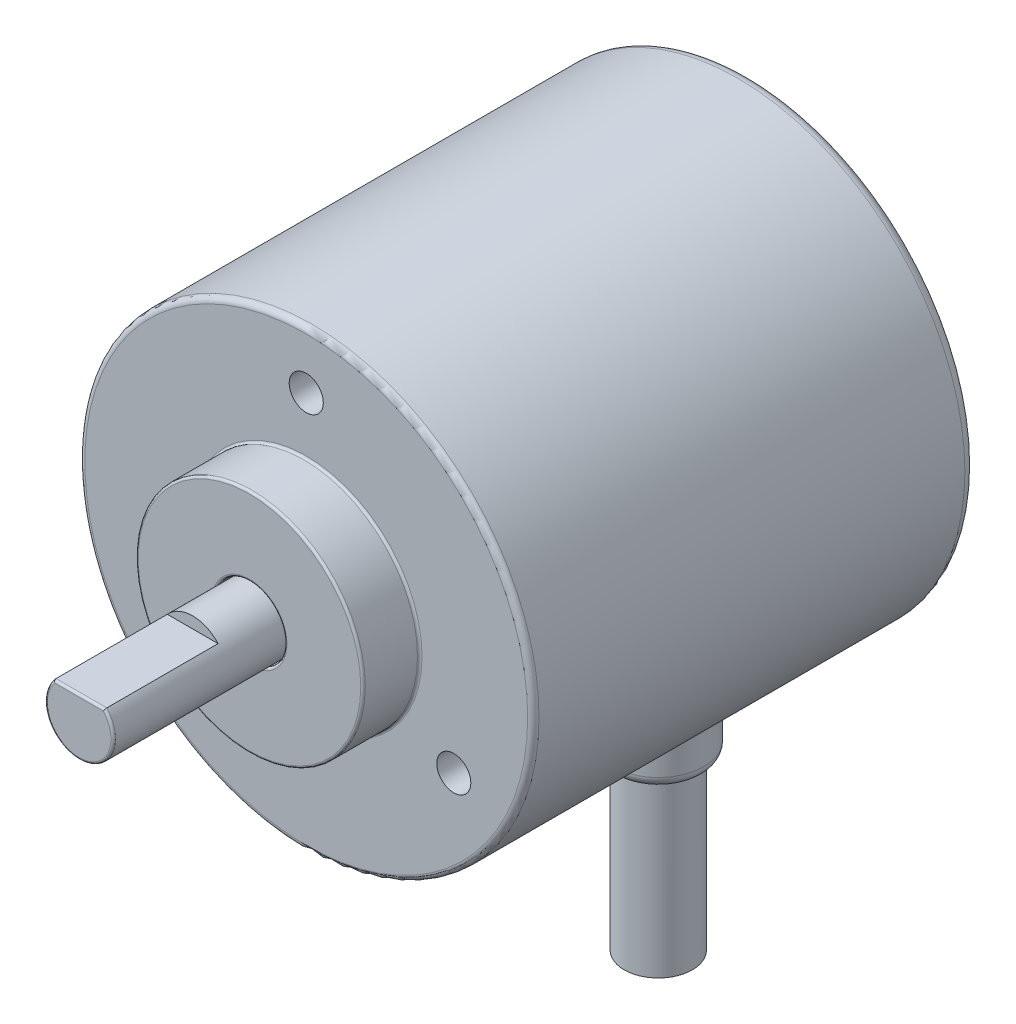
ISO-10303-21;
HEADER;
FILE_DESCRIPTION(('STEP AP214'),'2;1');
FILE_NAME('part.step','',(''),(''),'','','');
FILE_SCHEMA(('AUTOMOTIVE_DESIGN { 1 0 10303 214 1 1 1 1 }'));
ENDSEC;
DATA;
#1=APPLICATION_CONTEXT('core data for automotive mechanical design processes');
#2=APPLICATION_PROTOCOL_DEFINITION('international standard','automotive_design',2000,#1);
#3=PRODUCT_CONTEXT('',#1,'mechanical');
#4=PRODUCT('Part','Part','',(#3));
#5=PRODUCT_RELATED_PRODUCT_CATEGORY('part','',(#4));
#6=PRODUCT_DEFINITION_FORMATION('','',#4);
#7=PRODUCT_DEFINITION_CONTEXT('part definition',#1,'design');
#8=PRODUCT_DEFINITION('design','',#6,#7);
#9=PRODUCT_DEFINITION_SHAPE('','',#8);
#10=(LENGTH_UNIT() NAMED_UNIT(*) SI_UNIT(.MILLI.,.METRE.));
#11=(NAMED_UNIT(*) PLANE_ANGLE_UNIT() SI_UNIT($,.RADIAN.));
#12=(NAMED_UNIT(*) SI_UNIT($,.STERADIAN.) SOLID_ANGLE_UNIT());
#13=UNCERTAINTY_MEASURE_WITH_UNIT(LENGTH_MEASURE(1.E-05),#10,'distance_accuracy_value','');
#14=(GEOMETRIC_REPRESENTATION_CONTEXT(3) GLOBAL_UNCERTAINTY_ASSIGNED_CONTEXT((#13)) GLOBAL_UNIT_ASSIGNED_CONTEXT((#10,
#11,#12)) REPRESENTATION_CONTEXT('',''));
#15=CARTESIAN_POINT('',(0.,0.,0.));
#16=DIRECTION('',(0.,0.,1.));
#17=DIRECTION('',(1.,0.,0.));
#18=AXIS2_PLACEMENT_3D('',#15,#16,#17);
#19=CARTESIAN_POINT('',(0.,0.,39.));
#20=DIRECTION('',(0.,0.,-1.));
#21=DIRECTION('',(-1.,0.,0.));
#22=AXIS2_PLACEMENT_3D('',#19,#20,#21);
#23=CYLINDRICAL_SURFACE('',#22,20.);
#24=CARTESIAN_POINT('',(0.,0.,1.));
#25=DIRECTION('',(0.,0.,1.));
#26=DIRECTION('',(1.,0.,0.));
#27=AXIS2_PLACEMENT_3D('',#24,#25,#26);
#28=CIRCLE('',#27,20.);
#29=CARTESIAN_POINT('',(20.,0.,1.));
#30=VERTEX_POINT('',#29);
#31=EDGE_CURVE('E195',#30,#30,#28,.T.);
#32=ORIENTED_EDGE('',*,*,#31,.T.);
#33=EDGE_LOOP('',(#32));
#34=FACE_BOUND('',#33,.T.);
#35=CARTESIAN_POINT('',(0.,0.,38.5));
#36=DIRECTION('',(0.,0.,1.));
#37=DIRECTION('',(1.,0.,0.));
#38=AXIS2_PLACEMENT_3D('',#35,#36,#37);
#39=CIRCLE('',#38,20.);
#40=CARTESIAN_POINT('',(20.,0.,38.5));
#41=VERTEX_POINT('',#40);
#42=EDGE_CURVE('E199',#41,#41,#39,.F.);
#43=ORIENTED_EDGE('',*,*,#42,.T.);
#44=EDGE_LOOP('',(#43));
#45=FACE_BOUND('',#44,.T.);
#46=CARTESIAN_POINT('',(0.,-20.,12.));
#47=CARTESIAN_POINT('',(0.222307627170533,-19.9999959032348,11.9999918220066));
#48=CARTESIAN_POINT('',(0.444718640806089,-19.9962554071292,11.9814046281294));
#49=CARTESIAN_POINT('',(0.883254030756077,-19.9816946249293,11.907605999539));
#50=CARTESIAN_POINT('',(1.09937327016542,-19.9708687144076,11.852365468794));
#51=CARTESIAN_POINT('',(1.51892122105325,-19.9433459711314,11.7070349055168));
#52=CARTESIAN_POINT('',(1.72236187173253,-19.9266547630683,11.6169782526213));
#53=CARTESIAN_POINT('',(2.1112319554569,-19.889215921413,11.4046710099548));
#54=CARTESIAN_POINT('',(2.29666246030325,-19.8684685294298,11.2824223375711));
#55=CARTESIAN_POINT('',(2.64677390925945,-19.8248866131972,11.0074460228343));
#56=CARTESIAN_POINT('',(2.81117580463408,-19.8020298201681,10.8543665784353));
#57=CARTESIAN_POINT('',(3.11214702643213,-19.7569672181094,10.5228303344331));
#58=CARTESIAN_POINT('',(3.24871417908175,-19.7347614600387,10.3443715546591));
#59=CARTESIAN_POINT('',(3.49132701339042,-19.6932976724827,9.96513522795298));
#60=CARTESIAN_POINT('',(3.59708375546325,-19.6740682945156,9.76416942481637));
#61=CARTESIAN_POINT('',(3.77322266632145,-19.6410507224189,9.34687272398188));
#62=CARTESIAN_POINT('',(3.84360832974976,-19.6272619907853,9.13054334660788));
#63=CARTESIAN_POINT('',(3.94610119953993,-19.6069122097851,8.69166254436892));
#64=CARTESIAN_POINT('',(3.97869799183396,-19.6002588031638,8.4692298234434));
#65=CARTESIAN_POINT('',(4.00620851090316,-19.5946550013038,8.02196071455817));
#66=CARTESIAN_POINT('',(4.00112609085425,-19.5957038184152,7.79712457472649));
#67=CARTESIAN_POINT('',(3.9538182924077,-19.6053020462212,7.35501284791527));
#68=CARTESIAN_POINT('',(3.91215416097573,-19.6137381144293,7.13767437749055));
#69=CARTESIAN_POINT('',(3.79375153849209,-19.6369818463213,6.71313569334819));
#70=CARTESIAN_POINT('',(3.71701137240269,-19.65178981429,6.50593596432402));
#71=CARTESIAN_POINT('',(3.53009913469891,-19.6862247400376,6.10593895318555));
#72=CARTESIAN_POINT('',(3.41970460492847,-19.7058835925539,5.9132484817233));
#73=CARTESIAN_POINT('',(3.16877429829071,-19.7477847509168,5.54891660010876));
#74=CARTESIAN_POINT('',(3.02823505742731,-19.7700273535331,5.37727761259538));
#75=CARTESIAN_POINT('',(2.71799973824234,-19.81508084966,5.05668239017225));
#76=CARTESIAN_POINT('',(2.54782464484978,-19.8378947684366,4.90818972856348));
#77=CARTESIAN_POINT('',(2.18474009624804,-19.8811539485759,4.64178461479511));
#78=CARTESIAN_POINT('',(1.99183034951756,-19.9015991795588,4.52387255482569));
#79=CARTESIAN_POINT('',(1.58823754751568,-19.9378676064356,4.3218899630961));
#80=CARTESIAN_POINT('',(1.3775272783412,-19.9536835539309,4.23787242542185));
#81=CARTESIAN_POINT('',(0.944595905794659,-19.9788563595143,4.10655810384573));
#82=CARTESIAN_POINT('',(0.722376200289799,-19.9882140000212,4.05925687170549));
#83=CARTESIAN_POINT('',(0.276717622508603,-19.9993068746747,4.00337418482289));
#84=CARTESIAN_POINT('',(0.0533613133023055,-20.0011669860988,3.99415832183893));
#85=CARTESIAN_POINT('',(-0.391699736770856,-19.9974020772041,4.01299943576872));
#86=CARTESIAN_POINT('',(-0.613404569775172,-19.9917774776578,4.04105431741038));
#87=CARTESIAN_POINT('',(-1.04682263978616,-19.9737532803207,4.13311349417582));
#88=CARTESIAN_POINT('',(-1.25860779335961,-19.9614150561683,4.19679227399161));
#89=CARTESIAN_POINT('',(-1.66849450999867,-19.9313420824413,4.35793593062324));
#90=CARTESIAN_POINT('',(-1.86659504655016,-19.9136069285691,4.45540333870732));
#91=CARTESIAN_POINT('',(-2.24616469474487,-19.8743964613318,4.68272996260525));
#92=CARTESIAN_POINT('',(-2.42740050700875,-19.8528780174821,4.81297112415578));
#93=CARTESIAN_POINT('',(-2.76567207647683,-19.8085893931953,5.10163676482912));
#94=CARTESIAN_POINT('',(-2.92270523572305,-19.7858190787355,5.26006426559947));
#95=CARTESIAN_POINT('',(-3.2105623630967,-19.7411721422786,5.6034934075645));
#96=CARTESIAN_POINT('',(-3.34095080979462,-19.7193144093322,5.78886297688535));
#97=CARTESIAN_POINT('',(-3.56874168020482,-19.6793676718478,6.17924544542672));
#98=CARTESIAN_POINT('',(-3.66614542369161,-19.6612785165337,6.38425755829421));
#99=CARTESIAN_POINT('',(-3.82460736632784,-19.6310696233753,6.80707298459819));
#100=CARTESIAN_POINT('',(-3.8858539991642,-19.6189189948875,7.02480336484127));
#101=CARTESIAN_POINT('',(-3.97083460650878,-19.601897471681,7.46773381396362));
#102=CARTESIAN_POINT('',(-3.99457347290045,-19.5970256276445,7.69293290483739));
#103=CARTESIAN_POINT('',(-4.00368364346987,-19.5951659852552,8.14003545817727));
#104=CARTESIAN_POINT('',(-3.98974315228358,-19.598036767572,8.36192459570804));
#105=CARTESIAN_POINT('',(-3.92540921640024,-19.6110229393846,8.80012659962011));
#106=CARTESIAN_POINT('',(-3.87501606451719,-19.6211382706868,9.01643951077922));
#107=CARTESIAN_POINT('',(-3.73951427399582,-19.6474105687663,9.43691084496218));
#108=CARTESIAN_POINT('',(-3.65449002686938,-19.6635528407532,9.64109744200966));
#109=CARTESIAN_POINT('',(-3.45221857840642,-19.7000685989668,10.0324148829378));
#110=CARTESIAN_POINT('',(-3.33496867509953,-19.7204424399558,10.2195442949005));
#111=CARTESIAN_POINT('',(-3.06922365914566,-19.763558420929,10.5748622886013));
#112=CARTESIAN_POINT('',(-2.92023154894072,-19.786334916388,10.7426750610704));
#113=CARTESIAN_POINT('',(-2.59625747605256,-19.8314432748782,11.0511448221167));
#114=CARTESIAN_POINT('',(-2.42126954861334,-19.8537750345274,11.1917955612691));
#115=CARTESIAN_POINT('',(-2.04807051635299,-19.8957532955189,11.4433385757858));
#116=CARTESIAN_POINT('',(-1.84963553771934,-19.9153692487698,11.5539040131201));
#117=CARTESIAN_POINT('',(-1.43666544376293,-19.9494050034,11.7399444903864));
#118=CARTESIAN_POINT('',(-1.22214504345251,-19.9638294855446,11.81545115813));
#119=CARTESIAN_POINT('',(-0.839285955695119,-19.9830549038148,11.9146077921789));
#120=CARTESIAN_POINT('',(-0.67312665605514,-19.9893721263381,11.946572774831));
#121=CARTESIAN_POINT('',(-0.337998100840269,-19.9978461655957,11.9892716494335));
#122=CARTESIAN_POINT('',(-0.169028934994477,-20.0000031149262,12.0000062180391));
#123=CARTESIAN_POINT('',(0.,-20.,12.));
#124=B_SPLINE_CURVE_WITH_KNOTS('',3,(#46,#47,#48,#49,#50,#51,#52,#53,#54,#55,#56,#57,#58,#59,
#60,#61,#62,#63,#64,#65,#66,#67,#68,#69,#70,#71,#72,#73,#74,#75,#76,#77,#78,#79,#80,#81,#82,#83,
#84,#85,#86,#87,#88,#89,#90,#91,#92,#93,#94,#95,#96,#97,#98,#99,#100,#101,#102,#103,#104,#105,
#106,#107,#108,#109,#110,#111,#112,#113,#114,#115,#116,#117,#118,#119,#120,#121,#122,#123),
.UNSPECIFIED.,.T.,.F.,(4,2,2,2,2,2,2,2,2,2,2,2,2,2,2,2,2,2,2,2,2,2,2,2,2,2,2,2,2,2,2,2,2,2,2,2,
2,2,4),(0.,0.666304522645034,1.33313860276529,1.99933494100137,2.66549160892345,
3.33973068044874,4.01402238698946,4.6944478002369,5.3748059746079,6.04624740416218,
6.71762017128681,7.37886908028893,8.04014957018699,8.7058996081815,9.37172619002462,
10.0495300996918,10.7273427016306,11.4062109941988,12.0849970279592,12.7524294270884,
13.4198243063525,14.0812181580667,14.7426615686787,15.4122026413721,16.081815533875,
16.7616251432068,17.4414075489765,18.1176152413467,18.7937347332544,19.4575889027459,
20.1214377397421,20.7836784501622,21.4459747033125,22.1195230496035,22.793226181355,
23.4739798670633,24.1541182207385,24.6607510116336,25.1673676548776),.UNSPECIFIED.);
#125=CARTESIAN_POINT('',(0.,-20.,12.));
#126=VERTEX_POINT('',#125);
#127=EDGE_CURVE('E111',#126,#126,#124,.T.);
#128=ORIENTED_EDGE('',*,*,#127,.T.);
#129=EDGE_LOOP('',(#128));
#130=FACE_BOUND('',#129,.T.);
#131=ADVANCED_FACE('F51',(#34,#45,#130),#23,.T.);
#132=CARTESIAN_POINT('',(0.,0.,39.));
#133=DIRECTION('',(0.,0.,1.));
#134=DIRECTION('',(1.,0.,0.));
#135=AXIS2_PLACEMENT_3D('',#132,#133,#134);
#136=PLANE('',#135);
#137=CARTESIAN_POINT('',(0.,0.,39.));
#138=DIRECTION('',(0.,0.,1.));
#139=DIRECTION('',(1.,0.,0.));
#140=AXIS2_PLACEMENT_3D('',#137,#138,#139);
#141=CIRCLE('',#140,10.2);
#142=CARTESIAN_POINT('',(10.2,0.,39.));
#143=VERTEX_POINT('',#142);
#144=EDGE_CURVE('E255',#143,#143,#141,.F.);
#145=ORIENTED_EDGE('',*,*,#144,.T.);
#146=EDGE_LOOP('',(#145));
#147=FACE_BOUND('',#146,.T.);
#148=CARTESIAN_POINT('',(0.,0.,39.));
#149=DIRECTION('',(0.,0.,1.));
#150=DIRECTION('',(1.,0.,0.));
#151=AXIS2_PLACEMENT_3D('',#148,#149,#150);
#152=CIRCLE('',#151,19.5);
#153=CARTESIAN_POINT('',(19.5,0.,39.));
#154=VERTEX_POINT('',#153);
#155=EDGE_CURVE('E108',#154,#154,#152,.T.);
#156=ORIENTED_EDGE('',*,*,#155,.T.);
#157=EDGE_LOOP('',(#156));
#158=FACE_BOUND('',#157,.T.);
#159=CARTESIAN_POINT('',(0.,15.,39.));
#160=DIRECTION('',(0.,0.,1.));
#161=DIRECTION('',(1.,0.,0.));
#162=AXIS2_PLACEMENT_3D('',#159,#160,#161);
#163=CIRCLE('',#162,1.5);
#164=CARTESIAN_POINT('',(1.5,15.,39.));
#165=VERTEX_POINT('',#164);
#166=EDGE_CURVE('E280',#165,#165,#163,.T.);
#167=ORIENTED_EDGE('',*,*,#166,.F.);
#168=EDGE_LOOP('',(#167));
#169=FACE_BOUND('',#168,.T.);
#170=CARTESIAN_POINT('',(12.9903810567675,-7.49999999999945,39.));
#171=DIRECTION('',(0.,0.,1.));
#172=DIRECTION('',(1.,0.,0.));
#173=AXIS2_PLACEMENT_3D('',#170,#171,#172);
#174=CIRCLE('',#173,1.50000000000082);
#175=CARTESIAN_POINT('',(14.4903810567684,-7.49999999999945,39.));
#176=VERTEX_POINT('',#175);
#177=EDGE_CURVE('E286',#176,#176,#174,.T.);
#178=ORIENTED_EDGE('',*,*,#177,.F.);
#179=EDGE_LOOP('',(#178));
#180=FACE_BOUND('',#179,.T.);
#181=CARTESIAN_POINT('',(-12.9903810567656,-7.50000000000056,39.));
#182=DIRECTION('',(0.,0.,1.));
#183=DIRECTION('',(1.,0.,0.));
#184=AXIS2_PLACEMENT_3D('',#181,#182,#183);
#185=CIRCLE('',#184,1.50000000000122);
#186=CARTESIAN_POINT('',(-11.4903810567644,-7.50000000000056,39.));
#187=VERTEX_POINT('',#186);
#188=EDGE_CURVE('E119',#187,#187,#185,.T.);
#189=ORIENTED_EDGE('',*,*,#188,.F.);
#190=EDGE_LOOP('',(#189));
#191=FACE_BOUND('',#190,.T.);
#192=ADVANCED_FACE('F180',(#147,#158,#169,#180,#191),#136,.T.);
#193=CARTESIAN_POINT('',(0.,0.,0.));
#194=DIRECTION('',(0.,0.,1.));
#195=DIRECTION('',(1.,0.,0.));
#196=AXIS2_PLACEMENT_3D('',#193,#194,#195);
#197=PLANE('',#196);
#198=CARTESIAN_POINT('',(0.,0.,0.));
#199=DIRECTION('',(0.,0.,1.));
#200=DIRECTION('',(1.,0.,0.));
#201=AXIS2_PLACEMENT_3D('',#198,#199,#200);
#202=CIRCLE('',#201,19.);
#203=CARTESIAN_POINT('',(19.,0.,0.));
#204=VERTEX_POINT('',#203);
#205=EDGE_CURVE('E203',#204,#204,#202,.F.);
#206=ORIENTED_EDGE('',*,*,#205,.T.);
#207=EDGE_LOOP('',(#206));
#208=FACE_BOUND('',#207,.T.);
#209=ADVANCED_FACE('F178',(#208),#197,.F.);
#210=CARTESIAN_POINT('',(0.,0.,44.));
#211=DIRECTION('',(0.,0.,-1.));
#212=DIRECTION('',(-1.,0.,0.));
#213=AXIS2_PLACEMENT_3D('',#210,#211,#212);
#214=CYLINDRICAL_SURFACE('',#213,10.);
#215=CARTESIAN_POINT('',(0.,0.,39.2));
#216=DIRECTION('',(0.,0.,1.));
#217=DIRECTION('',(1.,0.,0.));
#218=AXIS2_PLACEMENT_3D('',#215,#216,#217);
#219=CIRCLE('',#218,10.);
#220=CARTESIAN_POINT('',(10.,0.,39.2));
#221=VERTEX_POINT('',#220);
#222=EDGE_CURVE('E226',#221,#221,#219,.T.);
#223=ORIENTED_EDGE('',*,*,#222,.T.);
#224=EDGE_LOOP('',(#223));
#225=FACE_BOUND('',#224,.T.);
#226=CARTESIAN_POINT('',(0.,0.,43.8));
#227=DIRECTION('',(0.,0.,1.));
#228=DIRECTION('',(1.,0.,0.));
#229=AXIS2_PLACEMENT_3D('',#226,#227,#228);
#230=CIRCLE('',#229,10.);
#231=CARTESIAN_POINT('',(10.,0.,43.8));
#232=VERTEX_POINT('',#231);
#233=EDGE_CURVE('E217',#232,#232,#230,.F.);
#234=ORIENTED_EDGE('',*,*,#233,.T.);
#235=EDGE_LOOP('',(#234));
#236=FACE_BOUND('',#235,.T.);
#237=ADVANCED_FACE('F174',(#225,#236),#214,.T.);
#238=CARTESIAN_POINT('',(0.,0.,44.));
#239=DIRECTION('',(0.,0.,1.));
#240=DIRECTION('',(1.,0.,0.));
#241=AXIS2_PLACEMENT_3D('',#238,#239,#240);
#242=PLANE('',#241);
#243=CARTESIAN_POINT('',(0.,0.,44.));
#244=DIRECTION('',(0.,0.,1.));
#245=DIRECTION('',(1.,0.,0.));
#246=AXIS2_PLACEMENT_3D('',#243,#244,#245);
#247=CIRCLE('',#246,3.3);
#248=CARTESIAN_POINT('',(3.3,0.,44.));
#249=VERTEX_POINT('',#248);
#250=EDGE_CURVE('E13',#249,#249,#247,.F.);
#251=ORIENTED_EDGE('',*,*,#250,.T.);
#252=EDGE_LOOP('',(#251));
#253=FACE_BOUND('',#252,.T.);
#254=CARTESIAN_POINT('',(0.,0.,44.));
#255=DIRECTION('',(0.,0.,1.));
#256=DIRECTION('',(1.,0.,0.));
#257=AXIS2_PLACEMENT_3D('',#254,#255,#256);
#258=CIRCLE('',#257,9.8);
#259=CARTESIAN_POINT('',(9.8,0.,44.));
#260=VERTEX_POINT('',#259);
#261=EDGE_CURVE('E214',#260,#260,#258,.T.);
#262=ORIENTED_EDGE('',*,*,#261,.T.);
#263=EDGE_LOOP('',(#262));
#264=FACE_BOUND('',#263,.T.);
#265=ADVANCED_FACE('F157',(#253,#264),#242,.T.);
#266=CARTESIAN_POINT('',(-12.9903810567656,-7.50000000000056,32.));
#267=DIRECTION('',(0.,0.,1.));
#268=DIRECTION('',(1.,0.,0.));
#269=AXIS2_PLACEMENT_3D('',#266,#267,#268);
#270=CYLINDRICAL_SURFACE('',#269,1.50000000000122);
#271=CARTESIAN_POINT('',(-12.9903810567656,-7.50000000000056,32.));
#272=DIRECTION('',(0.,0.,1.));
#273=DIRECTION('',(1.,0.,0.));
#274=AXIS2_PLACEMENT_3D('',#271,#272,#273);
#275=CIRCLE('',#274,1.50000000000122);
#276=CARTESIAN_POINT('',(-11.4903810567644,-7.50000000000056,32.));
#277=VERTEX_POINT('',#276);
#278=EDGE_CURVE('E289',#277,#277,#275,.T.);
#279=ORIENTED_EDGE('',*,*,#278,.F.);
#280=EDGE_LOOP('',(#279));
#281=FACE_BOUND('',#280,.T.);
#282=ORIENTED_EDGE('',*,*,#188,.T.);
#283=EDGE_LOOP('',(#282));
#284=FACE_BOUND('',#283,.T.);
#285=ADVANCED_FACE('F153',(#281,#284),#270,.F.);
#286=CARTESIAN_POINT('',(-12.9903810567656,-7.50000000000056,32.));
#287=DIRECTION('',(0.,0.,1.));
#288=DIRECTION('',(1.,0.,0.));
#289=AXIS2_PLACEMENT_3D('',#286,#287,#288);
#290=PLANE('',#289);
#291=ORIENTED_EDGE('',*,*,#278,.T.);
#292=EDGE_LOOP('',(#291));
#293=FACE_BOUND('',#292,.T.);
#294=ADVANCED_FACE('F149',(#293),#290,.T.);
#295=CARTESIAN_POINT('',(12.9903810567675,-7.49999999999945,32.));
#296=DIRECTION('',(0.,0.,1.));
#297=DIRECTION('',(1.,0.,0.));
#298=AXIS2_PLACEMENT_3D('',#295,#296,#297);
#299=CYLINDRICAL_SURFACE('',#298,1.50000000000082);
#300=CARTESIAN_POINT('',(12.9903810567675,-7.49999999999945,32.));
#301=DIRECTION('',(0.,0.,1.));
#302=DIRECTION('',(1.,0.,0.));
#303=AXIS2_PLACEMENT_3D('',#300,#301,#302);
#304=CIRCLE('',#303,1.50000000000082);
#305=CARTESIAN_POINT('',(14.4903810567684,-7.49999999999945,32.));
#306=VERTEX_POINT('',#305);
#307=EDGE_CURVE('E283',#306,#306,#304,.T.);
#308=ORIENTED_EDGE('',*,*,#307,.F.);
#309=EDGE_LOOP('',(#308));
#310=FACE_BOUND('',#309,.T.);
#311=ORIENTED_EDGE('',*,*,#177,.T.);
#312=EDGE_LOOP('',(#311));
#313=FACE_BOUND('',#312,.T.);
#314=ADVANCED_FACE('F145',(#310,#313),#299,.F.);
#315=CARTESIAN_POINT('',(12.9903810567675,-7.49999999999945,32.));
#316=DIRECTION('',(0.,0.,1.));
#317=DIRECTION('',(1.,0.,0.));
#318=AXIS2_PLACEMENT_3D('',#315,#316,#317);
#319=PLANE('',#318);
#320=ORIENTED_EDGE('',*,*,#307,.T.);
#321=EDGE_LOOP('',(#320));
#322=FACE_BOUND('',#321,.T.);
#323=ADVANCED_FACE('F141',(#322),#319,.T.);
#324=CARTESIAN_POINT('',(0.,15.,32.));
#325=DIRECTION('',(0.,0.,1.));
#326=DIRECTION('',(1.,0.,0.));
#327=AXIS2_PLACEMENT_3D('',#324,#325,#326);
#328=CYLINDRICAL_SURFACE('',#327,1.5);
#329=CARTESIAN_POINT('',(0.,15.,32.));
#330=DIRECTION('',(0.,0.,1.));
#331=DIRECTION('',(1.,0.,0.));
#332=AXIS2_PLACEMENT_3D('',#329,#330,#331);
#333=CIRCLE('',#332,1.5);
#334=CARTESIAN_POINT('',(1.5,15.,32.));
#335=VERTEX_POINT('',#334);
#336=EDGE_CURVE('E94',#335,#335,#333,.T.);
#337=ORIENTED_EDGE('',*,*,#336,.F.);
#338=EDGE_LOOP('',(#337));
#339=FACE_BOUND('',#338,.T.);
#340=ORIENTED_EDGE('',*,*,#166,.T.);
#341=EDGE_LOOP('',(#340));
#342=FACE_BOUND('',#341,.T.);
#343=ADVANCED_FACE('F137',(#339,#342),#328,.F.);
#344=CARTESIAN_POINT('',(0.,15.,32.));
#345=DIRECTION('',(0.,0.,1.));
#346=DIRECTION('',(1.,0.,0.));
#347=AXIS2_PLACEMENT_3D('',#344,#345,#346);
#348=PLANE('',#347);
#349=ORIENTED_EDGE('',*,*,#336,.T.);
#350=EDGE_LOOP('',(#349));
#351=FACE_BOUND('',#350,.T.);
#352=ADVANCED_FACE('F131',(#351),#348,.T.);
#353=CARTESIAN_POINT('',(0.,-28.,8.));
#354=DIRECTION('',(0.,1.,0.));
#355=DIRECTION('',(0.,0.,1.));
#356=AXIS2_PLACEMENT_3D('',#353,#354,#355);
#357=CYLINDRICAL_SURFACE('',#356,4.);
#358=CARTESIAN_POINT('',(0.,-27.,8.));
#359=DIRECTION('',(0.,1.,0.));
#360=DIRECTION('',(0.,0.,1.));
#361=AXIS2_PLACEMENT_3D('',#358,#359,#360);
#362=CIRCLE('',#361,4.);
#363=CARTESIAN_POINT('',(0.,-27.,12.));
#364=VERTEX_POINT('',#363);
#365=EDGE_CURVE('E208',#364,#364,#362,.T.);
#366=ORIENTED_EDGE('',*,*,#365,.T.);
#367=EDGE_LOOP('',(#366));
#368=FACE_BOUND('',#367,.T.);
#369=ORIENTED_EDGE('',*,*,#127,.F.);
#370=EDGE_LOOP('',(#369));
#371=FACE_BOUND('',#370,.T.);
#372=ADVANCED_FACE('F125',(#368,#371),#357,.T.);
#373=CARTESIAN_POINT('',(0.,0.,38.5));
#374=DIRECTION('',(0.,0.,1.));
#375=DIRECTION('',(1.,0.,0.));
#376=AXIS2_PLACEMENT_3D('',#373,#374,#375);
#377=TOROIDAL_SURFACE('',#376,19.5,0.5);
#378=ORIENTED_EDGE('',*,*,#42,.F.);
#379=EDGE_LOOP('',(#378));
#380=FACE_BOUND('',#379,.T.);
#381=ORIENTED_EDGE('',*,*,#155,.F.);
#382=EDGE_LOOP('',(#381));
#383=FACE_BOUND('',#382,.T.);
#384=ADVANCED_FACE('F130',(#380,#383),#377,.T.);
#385=CARTESIAN_POINT('',(0.,0.,1.));
#386=DIRECTION('',(0.,0.,1.));
#387=DIRECTION('',(1.,0.,0.));
#388=AXIS2_PLACEMENT_3D('',#385,#386,#387);
#389=TOROIDAL_SURFACE('',#388,19.,1.);
#390=ORIENTED_EDGE('',*,*,#205,.F.);
#391=EDGE_LOOP('',(#390));
#392=FACE_BOUND('',#391,.T.);
#393=ORIENTED_EDGE('',*,*,#31,.F.);
#394=EDGE_LOOP('',(#393));
#395=FACE_BOUND('',#394,.T.);
#396=ADVANCED_FACE('F316',(#392,#395),#389,.T.);
#397=CARTESIAN_POINT('',(0.,-27.,8.));
#398=DIRECTION('',(0.,1.,0.));
#399=DIRECTION('',(0.,0.,1.));
#400=AXIS2_PLACEMENT_3D('',#397,#398,#399);
#401=TOROIDAL_SURFACE('',#400,3.,1.);
#402=CARTESIAN_POINT('',(0.,-28.,8.));
#403=DIRECTION('',(0.,1.,0.));
#404=DIRECTION('',(0.,0.,1.));
#405=AXIS2_PLACEMENT_3D('',#402,#403,#404);
#406=CIRCLE('',#405,3.);
#407=CARTESIAN_POINT('',(0.,-28.,11.));
#408=VERTEX_POINT('',#407);
#409=EDGE_CURVE('E211',#408,#408,#406,.F.);
#410=ORIENTED_EDGE('',*,*,#409,.F.);
#411=EDGE_LOOP('',(#410));
#412=FACE_BOUND('',#411,.T.);
#413=ORIENTED_EDGE('',*,*,#365,.F.);
#414=EDGE_LOOP('',(#413));
#415=FACE_BOUND('',#414,.T.);
#416=ADVANCED_FACE('F311',(#412,#415),#401,.T.);
#417=CARTESIAN_POINT('',(0.,-43.,8.));
#418=DIRECTION('',(0.,1.,0.));
#419=DIRECTION('',(0.,0.,1.));
#420=AXIS2_PLACEMENT_3D('',#417,#418,#419);
#421=CYLINDRICAL_SURFACE('',#420,3.);
#422=CARTESIAN_POINT('',(0.,-43.,8.));
#423=DIRECTION('',(0.,-1.,0.));
#424=DIRECTION('',(0.,0.,-1.));
#425=AXIS2_PLACEMENT_3D('',#422,#423,#424);
#426=CIRCLE('',#425,3.);
#427=CARTESIAN_POINT('',(0.,-43.,5.));
#428=VERTEX_POINT('',#427);
#429=EDGE_CURVE('E120',#428,#428,#426,.T.);
#430=ORIENTED_EDGE('',*,*,#429,.F.);
#431=EDGE_LOOP('',(#430));
#432=FACE_BOUND('',#431,.T.);
#433=ORIENTED_EDGE('',*,*,#409,.T.);
#434=EDGE_LOOP('',(#433));
#435=FACE_BOUND('',#434,.T.);
#436=ADVANCED_FACE('F133',(#432,#435),#421,.T.);
#437=CARTESIAN_POINT('',(0.,-43.,8.));
#438=DIRECTION('',(0.,-1.,0.));
#439=DIRECTION('',(0.,0.,-1.));
#440=AXIS2_PLACEMENT_3D('',#437,#438,#439);
#441=PLANE('',#440);
#442=ORIENTED_EDGE('',*,*,#429,.T.);
#443=EDGE_LOOP('',(#442));
#444=FACE_BOUND('',#443,.T.);
#445=ADVANCED_FACE('F307',(#444),#441,.T.);
#446=CARTESIAN_POINT('',(0.,0.,43.8));
#447=DIRECTION('',(0.,0.,1.));
#448=DIRECTION('',(1.,0.,0.));
#449=AXIS2_PLACEMENT_3D('',#446,#447,#448);
#450=TOROIDAL_SURFACE('',#449,9.8,0.2);
#451=ORIENTED_EDGE('',*,*,#233,.F.);
#452=EDGE_LOOP('',(#451));
#453=FACE_BOUND('',#452,.T.);
#454=ORIENTED_EDGE('',*,*,#261,.F.);
#455=EDGE_LOOP('',(#454));
#456=FACE_BOUND('',#455,.T.);
#457=ADVANCED_FACE('F266',(#453,#456),#450,.T.);
#458=CARTESIAN_POINT('',(0.,0.,39.));
#459=DIRECTION('',(0.,0.,1.));
#460=DIRECTION('',(1.,0.,0.));
#461=AXIS2_PLACEMENT_3D('',#458,#459,#460);
#462=CYLINDRICAL_SURFACE('',#461,3.1);
#463=CARTESIAN_POINT('',(0.,0.,43.8));
#464=DIRECTION('',(0.,0.,1.));
#465=DIRECTION('',(1.,0.,0.));
#466=AXIS2_PLACEMENT_3D('',#463,#464,#465);
#467=CIRCLE('',#466,3.1);
#468=CARTESIAN_POINT('',(3.1,0.,43.8));
#469=VERTEX_POINT('',#468);
#470=EDGE_CURVE('E59',#469,#469,#467,.T.);
#471=ORIENTED_EDGE('',*,*,#470,.T.);
#472=EDGE_LOOP('',(#471));
#473=FACE_BOUND('',#472,.T.);
#474=CARTESIAN_POINT('',(0.,0.,39.));
#475=DIRECTION('',(0.,0.,1.));
#476=DIRECTION('',(1.,0.,0.));
#477=AXIS2_PLACEMENT_3D('',#474,#475,#476);
#478=CIRCLE('',#477,3.1);
#479=CARTESIAN_POINT('',(3.1,0.,39.));
#480=VERTEX_POINT('',#479);
#481=EDGE_CURVE('E235',#480,#480,#478,.T.);
#482=ORIENTED_EDGE('',*,*,#481,.F.);
#483=EDGE_LOOP('',(#482));
#484=FACE_BOUND('',#483,.T.);
#485=ADVANCED_FACE('F262',(#473,#484),#462,.F.);
#486=CARTESIAN_POINT('',(0.,0.,39.));
#487=DIRECTION('',(0.,0.,1.));
#488=DIRECTION('',(1.,0.,0.));
#489=AXIS2_PLACEMENT_3D('',#486,#487,#488);
#490=PLANE('',#489);
#491=CARTESIAN_POINT('',(0.,0.,39.));
#492=DIRECTION('',(0.,0.,1.));
#493=DIRECTION('',(1.,0.,0.));
#494=AXIS2_PLACEMENT_3D('',#491,#492,#493);
#495=CIRCLE('',#494,3.);
#496=CARTESIAN_POINT('',(3.,0.,39.));
#497=VERTEX_POINT('',#496);
#498=EDGE_CURVE('E271',#497,#497,#495,.T.);
#499=ORIENTED_EDGE('',*,*,#498,.F.);
#500=EDGE_LOOP('',(#499));
#501=FACE_BOUND('',#500,.T.);
#502=ORIENTED_EDGE('',*,*,#481,.T.);
#503=EDGE_LOOP('',(#502));
#504=FACE_BOUND('',#503,.T.);
#505=ADVANCED_FACE('F168',(#501,#504),#490,.T.);
#506=CARTESIAN_POINT('',(0.,0.,59.));
#507=DIRECTION('',(0.,0.,1.));
#508=DIRECTION('',(1.,0.,0.));
#509=AXIS2_PLACEMENT_3D('',#506,#507,#508);
#510=PLANE('',#509);
#511=CARTESIAN_POINT('',(0.,0.,59.));
#512=DIRECTION('',(0.,0.,1.));
#513=DIRECTION('',(1.,0.,0.));
#514=AXIS2_PLACEMENT_3D('',#511,#512,#513);
#515=CIRCLE('',#514,2.8);
#516=CARTESIAN_POINT('',(-2.14476105895273,1.79999999999999,59.));
#517=VERTEX_POINT('',#516);
#518=CARTESIAN_POINT('',(2.14476105895273,1.79999999999999,59.));
#519=VERTEX_POINT('',#518);
#520=EDGE_CURVE('E65',#517,#519,#515,.T.);
#521=ORIENTED_EDGE('',*,*,#520,.T.);
#522=DIRECTION('',(1.,0.,0.));
#523=VECTOR('',#522,1.);
#524=CARTESIAN_POINT('',(-2.23606797749979,1.8,59.));
#525=LINE('',#524,#523);
#526=EDGE_CURVE('E223',#519,#517,#525,.F.);
#527=ORIENTED_EDGE('',*,*,#526,.T.);
#528=EDGE_LOOP('',(#521,#527));
#529=FACE_BOUND('',#528,.T.);
#530=ADVANCED_FACE('F165',(#529),#510,.T.);
#531=CARTESIAN_POINT('',(-2.23606797749979,1.8,58.8));
#532=DIRECTION('',(-1.,0.,0.));
#533=DIRECTION('',(0.,0.,1.));
#534=AXIS2_PLACEMENT_3D('',#531,#532,#533);
#535=CYLINDRICAL_SURFACE('',#534,0.2);
#536=CARTESIAN_POINT('',(-2.23606797749979,2.,58.8));
#537=CARTESIAN_POINT('',(-2.2360731035532,2.00001226477816,58.8105412974813));
#538=CARTESIAN_POINT('',(-2.23569565374879,1.999167463488,58.8210742526492));
#539=CARTESIAN_POINT('',(-2.2342161132502,1.99586033735214,58.8417989996809));
#540=CARTESIAN_POINT('',(-2.23311623581885,1.99340295291226,58.8519917339565));
#541=CARTESIAN_POINT('',(-2.23023242201733,1.98696735741533,58.8717758981145));
#542=CARTESIAN_POINT('',(-2.22844872870783,1.98298968674183,58.8813675402458));
#543=CARTESIAN_POINT('',(-2.22426357437987,1.97367202660336,58.8997192406992));
#544=CARTESIAN_POINT('',(-2.22186184089063,1.96833143628676,58.9084789299065));
#545=CARTESIAN_POINT('',(-2.21642673283746,1.95626992804021,58.9252604107909));
#546=CARTESIAN_POINT('',(-2.21337442112303,1.94950773633133,58.9332463066909));
#547=CARTESIAN_POINT('',(-2.20678606763883,1.93494695026992,58.9479751919944));
#548=CARTESIAN_POINT('',(-2.20324986920365,1.92714802028159,58.9547177771911));
#549=CARTESIAN_POINT('',(-2.19547929879877,1.91005653031537,58.9673609580929));
#550=CARTESIAN_POINT('',(-2.19121138073784,1.90069380026454,58.9731459407533));
#551=CARTESIAN_POINT('',(-2.18233306948074,1.88127896425018,58.9830645490059));
#552=CARTESIAN_POINT('',(-2.17772252474549,1.87122655340299,58.9871974386828));
#553=CARTESIAN_POINT('',(-2.16865481656138,1.85152240983793,58.9935038012622));
#554=CARTESIAN_POINT('',(-2.16421536774925,1.84190394591051,58.9958086287318));
#555=CARTESIAN_POINT('',(-2.15522959017844,1.82249724017757,58.998972941287));
#556=CARTESIAN_POINT('',(-2.15068348022152,1.81270935517825,58.9998351607599));
#557=CARTESIAN_POINT('',(-2.14567135106759,1.80195266760289,58.9999928653291));
#558=CARTESIAN_POINT('',(-2.14521623678421,1.80097624495082,59.0000000158604));
#559=CARTESIAN_POINT('',(-2.14476105895272,1.8,59.));
#560=B_SPLINE_CURVE_WITH_KNOTS('',3,(#536,#537,#538,#539,#540,#541,#542,#543,#544,#545,#546,
#547,#548,#549,#550,#551,#552,#553,#554,#555,#556,#557,#558,#559),.UNSPECIFIED.,.F.,.F.,(4,2,2,
2,2,2,2,2,2,2,2,4),(0.,0.0315703837962234,0.0630444954279978,0.0945074300210117,
0.125984259279107,0.158547322683533,0.191120953912736,0.226386194079425,0.261667125487646,
0.294096924904605,0.326465185421651,0.329696982779365),.UNSPECIFIED.);
#561=CARTESIAN_POINT('',(-2.23606797749979,2.,58.8));
#562=VERTEX_POINT('',#561);
#563=EDGE_CURVE('E72',#562,#517,#560,.T.);
#564=ORIENTED_EDGE('',*,*,#563,.T.);
#565=ORIENTED_EDGE('',*,*,#526,.F.);
#566=CARTESIAN_POINT('',(2.23606797749979,2.,58.8));
#567=CARTESIAN_POINT('',(2.2360731035532,2.00001226477816,58.8105412974813));
#568=CARTESIAN_POINT('',(2.23569565374879,1.999167463488,58.8210742526492));
#569=CARTESIAN_POINT('',(2.2342161132502,1.99586033735214,58.8417989996809));
#570=CARTESIAN_POINT('',(2.23311623581885,1.99340295291226,58.8519917339565));
#571=CARTESIAN_POINT('',(2.23023242201733,1.98696735741533,58.8717758981145));
#572=CARTESIAN_POINT('',(2.22844872870783,1.98298968674183,58.8813675402458));
#573=CARTESIAN_POINT('',(2.22426357437987,1.97367202660336,58.8997192406992));
#574=CARTESIAN_POINT('',(2.22186184089063,1.96833143628676,58.9084789299065));
#575=CARTESIAN_POINT('',(2.21642673283746,1.95626992804021,58.9252604107909));
#576=CARTESIAN_POINT('',(2.21337442112303,1.94950773633133,58.9332463066909));
#577=CARTESIAN_POINT('',(2.20678606763883,1.93494695026992,58.9479751919944));
#578=CARTESIAN_POINT('',(2.20324986920365,1.92714802028159,58.9547177771911));
#579=CARTESIAN_POINT('',(2.19547929879877,1.91005653031537,58.9673609580929));
#580=CARTESIAN_POINT('',(2.19121138073784,1.90069380026454,58.9731459407533));
#581=CARTESIAN_POINT('',(2.18233306948074,1.88127896425018,58.9830645490059));
#582=CARTESIAN_POINT('',(2.17772252474549,1.87122655340299,58.9871974386828));
#583=CARTESIAN_POINT('',(2.16865481656138,1.85152240983793,58.9935038012622));
#584=CARTESIAN_POINT('',(2.16421536774925,1.84190394591051,58.9958086287318));
#585=CARTESIAN_POINT('',(2.15522959017844,1.82249724017757,58.998972941287));
#586=CARTESIAN_POINT('',(2.15068348022152,1.81270935517825,58.9998351607599));
#587=CARTESIAN_POINT('',(2.14567135106759,1.80195266760289,58.9999928653291));
#588=CARTESIAN_POINT('',(2.14521623678421,1.80097624495082,59.0000000158604));
#589=CARTESIAN_POINT('',(2.14476105895272,1.8,59.));
#590=B_SPLINE_CURVE_WITH_KNOTS('',3,(#566,#567,#568,#569,#570,#571,#572,#573,#574,#575,#576,
#577,#578,#579,#580,#581,#582,#583,#584,#585,#586,#587,#588,#589),.UNSPECIFIED.,.F.,.F.,(4,2,2,
2,2,2,2,2,2,2,2,4),(0.,0.0315703837962234,0.0630444954279978,0.0945074300210117,
0.125984259279107,0.158547322683533,0.191120953912736,0.226386194079425,0.261667125487646,
0.294096924904605,0.326465185421651,0.329696982779365),.UNSPECIFIED.);
#591=CARTESIAN_POINT('',(2.23606797749979,2.,58.8));
#592=VERTEX_POINT('',#591);
#593=EDGE_CURVE('E227',#519,#592,#590,.F.);
#594=ORIENTED_EDGE('',*,*,#593,.T.);
#595=DIRECTION('',(1.,0.,0.));
#596=VECTOR('',#595,1.);
#597=CARTESIAN_POINT('',(2.23606797749979,2.,58.8));
#598=LINE('',#597,#596);
#599=EDGE_CURVE('E220',#562,#592,#598,.T.);
#600=ORIENTED_EDGE('',*,*,#599,.F.);
#601=EDGE_LOOP('',(#564,#565,#594,#600));
#602=FACE_BOUND('',#601,.T.);
#603=ADVANCED_FACE('F162',(#602),#535,.T.);
#604=CARTESIAN_POINT('',(0.,0.,49.));
#605=DIRECTION('',(0.,0.,1.));
#606=DIRECTION('',(1.,0.,0.));
#607=AXIS2_PLACEMENT_3D('',#604,#605,#606);
#608=PLANE('',#607);
#609=CARTESIAN_POINT('',(0.,0.,49.));
#610=DIRECTION('',(0.,0.,1.));
#611=DIRECTION('',(1.,0.,0.));
#612=AXIS2_PLACEMENT_3D('',#609,#610,#611);
#613=CIRCLE('',#612,3.);
#614=CARTESIAN_POINT('',(2.23606797749979,2.,49.));
#615=VERTEX_POINT('',#614);
#616=CARTESIAN_POINT('',(-2.23606797749979,2.,49.));
#617=VERTEX_POINT('',#616);
#618=EDGE_CURVE('E87',#615,#617,#613,.T.);
#619=ORIENTED_EDGE('',*,*,#618,.T.);
#620=DIRECTION('',(1.,0.,0.));
#621=VECTOR('',#620,1.);
#622=CARTESIAN_POINT('',(-2.23606797749979,2.,49.));
#623=LINE('',#622,#621);
#624=EDGE_CURVE('E90',#617,#615,#623,.T.);
#625=ORIENTED_EDGE('',*,*,#624,.T.);
#626=EDGE_LOOP('',(#619,#625));
#627=FACE_BOUND('',#626,.T.);
#628=ADVANCED_FACE('F89',(#627),#608,.T.);
#629=CARTESIAN_POINT('',(0.,0.,58.8));
#630=DIRECTION('',(0.,0.,1.));
#631=DIRECTION('',(1.,0.,0.));
#632=AXIS2_PLACEMENT_3D('',#629,#630,#631);
#633=TOROIDAL_SURFACE('',#632,2.8,0.2);
#634=ORIENTED_EDGE('',*,*,#593,.F.);
#635=ORIENTED_EDGE('',*,*,#520,.F.);
#636=ORIENTED_EDGE('',*,*,#563,.F.);
#637=CARTESIAN_POINT('',(0.,0.,58.8));
#638=DIRECTION('',(0.,0.,1.));
#639=DIRECTION('',(1.,0.,0.));
#640=AXIS2_PLACEMENT_3D('',#637,#638,#639);
#641=CIRCLE('',#640,3.);
#642=EDGE_CURVE('E106',#592,#562,#641,.F.);
#643=ORIENTED_EDGE('',*,*,#642,.F.);
#644=EDGE_LOOP('',(#634,#635,#636,#643));
#645=FACE_BOUND('',#644,.T.);
#646=ADVANCED_FACE('F161',(#645),#633,.T.);
#647=CARTESIAN_POINT('',(-2.23606797749979,2.,49.));
#648=DIRECTION('',(0.,-1.,0.));
#649=DIRECTION('',(0.,0.,-1.));
#650=AXIS2_PLACEMENT_3D('',#647,#648,#649);
#651=PLANE('',#650);
#652=DIRECTION('',(0.,0.,1.));
#653=VECTOR('',#652,1.);
#654=CARTESIAN_POINT('',(-2.23606797749979,2.,49.));
#655=LINE('',#654,#653);
#656=EDGE_CURVE('E100',#617,#562,#655,.T.);
#657=ORIENTED_EDGE('',*,*,#656,.T.);
#658=ORIENTED_EDGE('',*,*,#599,.T.);
#659=DIRECTION('',(0.,0.,1.));
#660=VECTOR('',#659,1.);
#661=CARTESIAN_POINT('',(2.23606797749979,2.,49.));
#662=LINE('',#661,#660);
#663=EDGE_CURVE('E101',#615,#592,#662,.T.);
#664=ORIENTED_EDGE('',*,*,#663,.F.);
#665=ORIENTED_EDGE('',*,*,#624,.F.);
#666=EDGE_LOOP('',(#657,#658,#664,#665));
#667=FACE_BOUND('',#666,.T.);
#668=ADVANCED_FACE('F98',(#667),#651,.F.);
#669=CARTESIAN_POINT('',(0.,0.,59.));
#670=DIRECTION('',(0.,0.,-1.));
#671=DIRECTION('',(-1.,0.,0.));
#672=AXIS2_PLACEMENT_3D('',#669,#670,#671);
#673=CYLINDRICAL_SURFACE('',#672,3.);
#674=ORIENTED_EDGE('',*,*,#663,.T.);
#675=ORIENTED_EDGE('',*,*,#642,.T.);
#676=ORIENTED_EDGE('',*,*,#656,.F.);
#677=ORIENTED_EDGE('',*,*,#618,.F.);
#678=EDGE_LOOP('',(#674,#675,#676,#677));
#679=FACE_BOUND('',#678,.T.);
#680=ORIENTED_EDGE('',*,*,#498,.T.);
#681=EDGE_LOOP('',(#680));
#682=FACE_BOUND('',#681,.T.);
#683=ADVANCED_FACE('F103',(#679,#682),#673,.T.);
#684=CARTESIAN_POINT('',(0.,0.,39.2));
#685=DIRECTION('',(0.,0.,1.));
#686=DIRECTION('',(1.,0.,0.));
#687=AXIS2_PLACEMENT_3D('',#684,#685,#686);
#688=TOROIDAL_SURFACE('',#687,10.2,0.2);
#689=ORIENTED_EDGE('',*,*,#144,.F.);
#690=EDGE_LOOP('',(#689));
#691=FACE_BOUND('',#690,.T.);
#692=ORIENTED_EDGE('',*,*,#222,.F.);
#693=EDGE_LOOP('',(#692));
#694=FACE_BOUND('',#693,.T.);
#695=ADVANCED_FACE('F171',(#691,#694),#688,.F.);
#696=CARTESIAN_POINT('',(0.,0.,43.8));
#697=DIRECTION('',(0.,0.,1.));
#698=DIRECTION('',(1.,0.,0.));
#699=AXIS2_PLACEMENT_3D('',#696,#697,#698);
#700=TOROIDAL_SURFACE('',#699,3.3,0.2);
#701=ORIENTED_EDGE('',*,*,#250,.F.);
#702=EDGE_LOOP('',(#701));
#703=FACE_BOUND('',#702,.T.);
#704=ORIENTED_EDGE('',*,*,#470,.F.);
#705=EDGE_LOOP('',(#704));
#706=FACE_BOUND('',#705,.T.);
#707=ADVANCED_FACE('F53',(#703,#706),#700,.T.);
#708=CLOSED_SHELL('',(#131,#192,#209,#237,#265,#285,#294,#314,#323,#343,#352,#372,#384,#396,
#416,#436,#445,#457,#485,#505,#530,#603,#628,#646,#668,#683,#695,#707));
#709=MANIFOLD_SOLID_BREP('B2',#708);
#710=ADVANCED_BREP_SHAPE_REPRESENTATION('',(#18,#709),#14);
#711=SHAPE_DEFINITION_REPRESENTATION(#9,#710);
ENDSEC;
END-ISO-10303-21;
